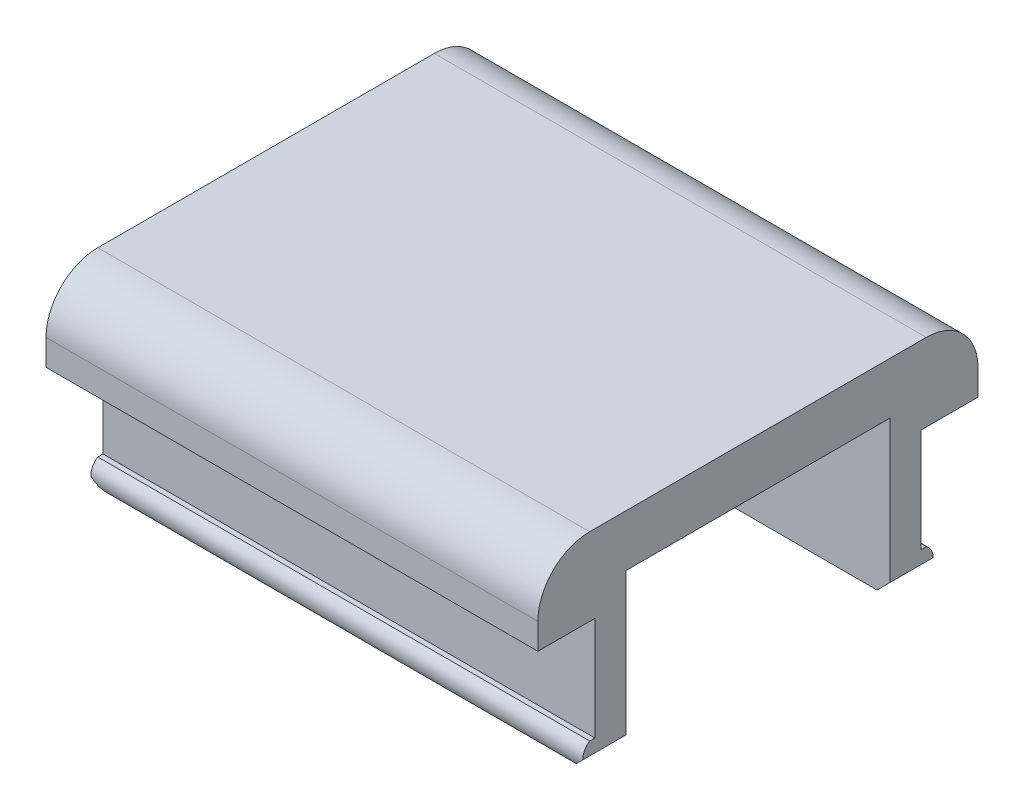
ISO-10303-21;
HEADER;
FILE_DESCRIPTION(('STEP AP214'),'2;1');
FILE_NAME('part.step','',(''),(''),'','','');
FILE_SCHEMA(('AUTOMOTIVE_DESIGN { 1 0 10303 214 1 1 1 1 }'));
ENDSEC;
DATA;
#1=APPLICATION_CONTEXT('core data for automotive mechanical design processes');
#2=APPLICATION_PROTOCOL_DEFINITION('international standard','automotive_design',2000,#1);
#3=PRODUCT_CONTEXT('',#1,'mechanical');
#4=PRODUCT('Part','Part','',(#3));
#5=PRODUCT_RELATED_PRODUCT_CATEGORY('part','',(#4));
#6=PRODUCT_DEFINITION_FORMATION('','',#4);
#7=PRODUCT_DEFINITION_CONTEXT('part definition',#1,'design');
#8=PRODUCT_DEFINITION('design','',#6,#7);
#9=PRODUCT_DEFINITION_SHAPE('','',#8);
#10=(LENGTH_UNIT() NAMED_UNIT(*) SI_UNIT(.MILLI.,.METRE.));
#11=(NAMED_UNIT(*) PLANE_ANGLE_UNIT() SI_UNIT($,.RADIAN.));
#12=(NAMED_UNIT(*) SI_UNIT($,.STERADIAN.) SOLID_ANGLE_UNIT());
#13=UNCERTAINTY_MEASURE_WITH_UNIT(LENGTH_MEASURE(1.E-05),#10,'distance_accuracy_value','');
#14=(GEOMETRIC_REPRESENTATION_CONTEXT(3) GLOBAL_UNCERTAINTY_ASSIGNED_CONTEXT((#13)) GLOBAL_UNIT_ASSIGNED_CONTEXT((#10,
#11,#12)) REPRESENTATION_CONTEXT('',''));
#15=CARTESIAN_POINT('',(0.,0.,0.));
#16=DIRECTION('',(0.,0.,1.));
#17=DIRECTION('',(1.,0.,0.));
#18=AXIS2_PLACEMENT_3D('',#15,#16,#17);
#19=CARTESIAN_POINT('',(0.,1.,-2.));
#20=DIRECTION('',(0.,1.,0.));
#21=DIRECTION('',(0.,0.,1.));
#22=AXIS2_PLACEMENT_3D('',#19,#20,#21);
#23=PLANE('',#22);
#24=DIRECTION('',(0.,0.,1.));
#25=VECTOR('',#24,1.);
#26=CARTESIAN_POINT('',(0.,1.,-2.));
#27=LINE('',#26,#25);
#28=CARTESIAN_POINT('',(0.,1.,-13.6));
#29=VERTEX_POINT('',#28);
#30=CARTESIAN_POINT('',(0.,1.,-3.4));
#31=VERTEX_POINT('',#30);
#32=EDGE_CURVE('E287',#29,#31,#27,.T.);
#33=ORIENTED_EDGE('',*,*,#32,.F.);
#34=DIRECTION('',(1.,0.,0.));
#35=VECTOR('',#34,1.);
#36=CARTESIAN_POINT('',(-6.05309838016863,1.,-13.6));
#37=LINE('',#36,#35);
#38=CARTESIAN_POINT('',(19.,1.,-13.6));
#39=VERTEX_POINT('',#38);
#40=EDGE_CURVE('E249',#29,#39,#37,.T.);
#41=ORIENTED_EDGE('',*,*,#40,.T.);
#42=DIRECTION('',(0.,0.,1.));
#43=VECTOR('',#42,1.);
#44=CARTESIAN_POINT('',(19.,1.,-2.));
#45=LINE('',#44,#43);
#46=CARTESIAN_POINT('',(19.,1.,-3.4));
#47=VERTEX_POINT('',#46);
#48=EDGE_CURVE('E286',#39,#47,#45,.T.);
#49=ORIENTED_EDGE('',*,*,#48,.T.);
#50=DIRECTION('',(1.,0.,0.));
#51=VECTOR('',#50,1.);
#52=CARTESIAN_POINT('',(-6.05309838016863,1.,-3.4));
#53=LINE('',#52,#51);
#54=EDGE_CURVE('E263',#31,#47,#53,.T.);
#55=ORIENTED_EDGE('',*,*,#54,.F.);
#56=EDGE_LOOP('',(#33,#41,#49,#55));
#57=FACE_BOUND('',#56,.T.);
#58=ADVANCED_FACE('F46',(#57),#23,.F.);
#59=CARTESIAN_POINT('',(19.,0.,0.));
#60=DIRECTION('',(0.,1.,0.));
#61=DIRECTION('',(0.,0.,1.));
#62=AXIS2_PLACEMENT_3D('',#59,#60,#61);
#63=PLANE('',#62);
#64=DIRECTION('',(0.,0.,-1.));
#65=VECTOR('',#64,1.);
#66=CARTESIAN_POINT('',(0.,0.,0.));
#67=LINE('',#66,#65);
#68=CARTESIAN_POINT('',(0.,0.,0.));
#69=VERTEX_POINT('',#68);
#70=CARTESIAN_POINT('',(0.,0.,-2.2));
#71=VERTEX_POINT('',#70);
#72=EDGE_CURVE('E207',#69,#71,#67,.T.);
#73=ORIENTED_EDGE('',*,*,#72,.T.);
#74=DIRECTION('',(1.,0.,0.));
#75=VECTOR('',#74,1.);
#76=CARTESIAN_POINT('',(-4.00499687890016,0.,-2.2));
#77=LINE('',#76,#75);
#78=CARTESIAN_POINT('',(19.,0.,-2.2));
#79=VERTEX_POINT('',#78);
#80=EDGE_CURVE('E242',#71,#79,#77,.T.);
#81=ORIENTED_EDGE('',*,*,#80,.T.);
#82=DIRECTION('',(0.,0.,-1.));
#83=VECTOR('',#82,1.);
#84=CARTESIAN_POINT('',(19.,0.,0.));
#85=LINE('',#84,#83);
#86=CARTESIAN_POINT('',(19.,0.,0.));
#87=VERTEX_POINT('',#86);
#88=EDGE_CURVE('E295',#87,#79,#85,.T.);
#89=ORIENTED_EDGE('',*,*,#88,.F.);
#90=DIRECTION('',(-1.,0.,0.));
#91=VECTOR('',#90,1.);
#92=CARTESIAN_POINT('',(19.,0.,0.));
#93=LINE('',#92,#91);
#94=EDGE_CURVE('E309',#87,#69,#93,.T.);
#95=ORIENTED_EDGE('',*,*,#94,.T.);
#96=EDGE_LOOP('',(#73,#81,#89,#95));
#97=FACE_BOUND('',#96,.T.);
#98=ADVANCED_FACE('F403',(#97),#63,.F.);
#99=CARTESIAN_POINT('',(19.,0.,0.));
#100=DIRECTION('',(0.,0.,-1.));
#101=DIRECTION('',(-1.,0.,0.));
#102=AXIS2_PLACEMENT_3D('',#99,#100,#101);
#103=PLANE('',#102);
#104=DIRECTION('',(0.,-1.,0.));
#105=VECTOR('',#104,1.);
#106=CARTESIAN_POINT('',(19.,0.,0.));
#107=LINE('',#106,#105);
#108=CARTESIAN_POINT('',(19.,1.,0.));
#109=VERTEX_POINT('',#108);
#110=EDGE_CURVE('E292',#109,#87,#107,.T.);
#111=ORIENTED_EDGE('',*,*,#110,.F.);
#112=DIRECTION('',(-1.,0.,0.));
#113=VECTOR('',#112,1.);
#114=CARTESIAN_POINT('',(19.,1.,0.));
#115=LINE('',#114,#113);
#116=CARTESIAN_POINT('',(0.,1.,0.));
#117=VERTEX_POINT('',#116);
#118=EDGE_CURVE('E327',#109,#117,#115,.T.);
#119=ORIENTED_EDGE('',*,*,#118,.T.);
#120=DIRECTION('',(0.,-1.,0.));
#121=VECTOR('',#120,1.);
#122=CARTESIAN_POINT('',(0.,0.,0.));
#123=LINE('',#122,#121);
#124=EDGE_CURVE('E208',#117,#69,#123,.T.);
#125=ORIENTED_EDGE('',*,*,#124,.T.);
#126=ORIENTED_EDGE('',*,*,#94,.F.);
#127=EDGE_LOOP('',(#111,#119,#125,#126));
#128=FACE_BOUND('',#127,.T.);
#129=ADVANCED_FACE('F407',(#128),#103,.F.);
#130=CARTESIAN_POINT('',(19.,0.,-14.8));
#131=VERTEX_POINT('',#130);
#132=CARTESIAN_POINT('',(19.,0.,-17.));
#133=VERTEX_POINT('',#132);
#134=EDGE_CURVE('E220',#131,#133,#85,.T.);
#135=ORIENTED_EDGE('',*,*,#134,.F.);
#136=DIRECTION('',(1.,0.,0.));
#137=VECTOR('',#136,1.);
#138=CARTESIAN_POINT('',(-4.00499687890016,0.,-14.8));
#139=LINE('',#138,#137);
#140=CARTESIAN_POINT('',(0.,0.,-14.8));
#141=VERTEX_POINT('',#140);
#142=EDGE_CURVE('E215',#141,#131,#139,.T.);
#143=ORIENTED_EDGE('',*,*,#142,.F.);
#144=CARTESIAN_POINT('',(0.,0.,-17.));
#145=VERTEX_POINT('',#144);
#146=EDGE_CURVE('E196',#141,#145,#67,.T.);
#147=ORIENTED_EDGE('',*,*,#146,.T.);
#148=DIRECTION('',(-1.,0.,0.));
#149=VECTOR('',#148,1.);
#150=CARTESIAN_POINT('',(19.,0.,-17.));
#151=LINE('',#150,#149);
#152=EDGE_CURVE('E303',#133,#145,#151,.T.);
#153=ORIENTED_EDGE('',*,*,#152,.F.);
#154=EDGE_LOOP('',(#135,#143,#147,#153));
#155=FACE_BOUND('',#154,.T.);
#156=ADVANCED_FACE('F219',(#155),#63,.F.);
#157=CARTESIAN_POINT('',(19.,0.,-17.));
#158=DIRECTION('',(0.,0.,1.));
#159=DIRECTION('',(1.,0.,0.));
#160=AXIS2_PLACEMENT_3D('',#157,#158,#159);
#161=PLANE('',#160);
#162=DIRECTION('',(0.,1.,0.));
#163=VECTOR('',#162,1.);
#164=CARTESIAN_POINT('',(0.,0.,-17.));
#165=LINE('',#164,#163);
#166=CARTESIAN_POINT('',(0.,1.,-17.));
#167=VERTEX_POINT('',#166);
#168=EDGE_CURVE('E202',#145,#167,#165,.T.);
#169=ORIENTED_EDGE('',*,*,#168,.T.);
#170=DIRECTION('',(-1.,0.,0.));
#171=VECTOR('',#170,1.);
#172=CARTESIAN_POINT('',(19.,1.,-17.));
#173=LINE('',#172,#171);
#174=CARTESIAN_POINT('',(19.,1.,-17.));
#175=VERTEX_POINT('',#174);
#176=EDGE_CURVE('E321',#167,#175,#173,.F.);
#177=ORIENTED_EDGE('',*,*,#176,.T.);
#178=DIRECTION('',(0.,1.,0.));
#179=VECTOR('',#178,1.);
#180=CARTESIAN_POINT('',(19.,0.,-17.));
#181=LINE('',#180,#179);
#182=EDGE_CURVE('E297',#133,#175,#181,.T.);
#183=ORIENTED_EDGE('',*,*,#182,.F.);
#184=ORIENTED_EDGE('',*,*,#152,.T.);
#185=EDGE_LOOP('',(#169,#177,#183,#184));
#186=FACE_BOUND('',#185,.T.);
#187=ADVANCED_FACE('F423',(#186),#161,.F.);
#188=CARTESIAN_POINT('',(19.,3.,0.));
#189=DIRECTION('',(0.,-1.,0.));
#190=DIRECTION('',(0.,0.,-1.));
#191=AXIS2_PLACEMENT_3D('',#188,#189,#190);
#192=PLANE('',#191);
#193=DIRECTION('',(0.,0.,1.));
#194=VECTOR('',#193,1.);
#195=CARTESIAN_POINT('',(19.,3.,0.));
#196=LINE('',#195,#194);
#197=CARTESIAN_POINT('',(19.,3.,-15.));
#198=VERTEX_POINT('',#197);
#199=CARTESIAN_POINT('',(19.,3.,-2.));
#200=VERTEX_POINT('',#199);
#201=EDGE_CURVE('E300',#198,#200,#196,.T.);
#202=ORIENTED_EDGE('',*,*,#201,.F.);
#203=DIRECTION('',(-1.,0.,0.));
#204=VECTOR('',#203,1.);
#205=CARTESIAN_POINT('',(19.,3.,-15.));
#206=LINE('',#205,#204);
#207=CARTESIAN_POINT('',(0.,3.,-15.));
#208=VERTEX_POINT('',#207);
#209=EDGE_CURVE('E314',#198,#208,#206,.T.);
#210=ORIENTED_EDGE('',*,*,#209,.T.);
#211=DIRECTION('',(0.,0.,1.));
#212=VECTOR('',#211,1.);
#213=CARTESIAN_POINT('',(0.,3.,0.));
#214=LINE('',#213,#212);
#215=CARTESIAN_POINT('',(0.,3.,-2.));
#216=VERTEX_POINT('',#215);
#217=EDGE_CURVE('E294',#208,#216,#214,.T.);
#218=ORIENTED_EDGE('',*,*,#217,.T.);
#219=DIRECTION('',(-1.,0.,0.));
#220=VECTOR('',#219,1.);
#221=CARTESIAN_POINT('',(19.,3.,-2.));
#222=LINE('',#221,#220);
#223=EDGE_CURVE('E312',#216,#200,#222,.F.);
#224=ORIENTED_EDGE('',*,*,#223,.T.);
#225=EDGE_LOOP('',(#202,#210,#218,#224));
#226=FACE_BOUND('',#225,.T.);
#227=ADVANCED_FACE('F414',(#226),#192,.F.);
#228=CARTESIAN_POINT('',(19.,0.,0.));
#229=DIRECTION('',(-1.,0.,0.));
#230=DIRECTION('',(0.,0.,1.));
#231=AXIS2_PLACEMENT_3D('',#228,#229,#230);
#232=PLANE('',#231);
#233=DIRECTION('',(0.,-1.,0.));
#234=VECTOR('',#233,1.);
#235=CARTESIAN_POINT('',(19.,1.,-13.6));
#236=LINE('',#235,#234);
#237=CARTESIAN_POINT('',(19.,-4.49999999999999,-13.6));
#238=VERTEX_POINT('',#237);
#239=EDGE_CURVE('E245',#39,#238,#236,.T.);
#240=ORIENTED_EDGE('',*,*,#239,.T.);
#241=DIRECTION('',(0.,0.,-1.));
#242=VECTOR('',#241,1.);
#243=CARTESIAN_POINT('',(19.,-4.49999999999999,-15.));
#244=LINE('',#243,#242);
#245=CARTESIAN_POINT('',(19.,-4.49999999999999,-15.2683375209645));
#246=VERTEX_POINT('',#245);
#247=EDGE_CURVE('E342',#238,#246,#244,.T.);
#248=ORIENTED_EDGE('',*,*,#247,.T.);
#249=CARTESIAN_POINT('',(19.,-4.5,-14.6683375209645));
#250=DIRECTION('',(1.,0.,0.));
#251=DIRECTION('',(0.,0.,-1.));
#252=AXIS2_PLACEMENT_3D('',#249,#250,#251);
#253=CIRCLE('',#252,0.599999999999999);
#254=CARTESIAN_POINT('',(19.,-4.,-15.));
#255=VERTEX_POINT('',#254);
#256=EDGE_CURVE('E266',#246,#255,#253,.T.);
#257=ORIENTED_EDGE('',*,*,#256,.T.);
#258=DIRECTION('',(0.,0.,-1.));
#259=VECTOR('',#258,1.);
#260=CARTESIAN_POINT('',(19.,-4.,-15.));
#261=LINE('',#260,#259);
#262=CARTESIAN_POINT('',(19.,-4.,-14.8));
#263=VERTEX_POINT('',#262);
#264=EDGE_CURVE('E221',#263,#255,#261,.T.);
#265=ORIENTED_EDGE('',*,*,#264,.F.);
#266=DIRECTION('',(0.,-1.,0.));
#267=VECTOR('',#266,1.);
#268=CARTESIAN_POINT('',(19.,0.,-14.8));
#269=LINE('',#268,#267);
#270=EDGE_CURVE('E224',#131,#263,#269,.T.);
#271=ORIENTED_EDGE('',*,*,#270,.F.);
#272=ORIENTED_EDGE('',*,*,#134,.T.);
#273=ORIENTED_EDGE('',*,*,#182,.T.);
#274=CARTESIAN_POINT('',(19.,1.,-15.));
#275=DIRECTION('',(-1.,0.,0.));
#276=DIRECTION('',(0.,0.,1.));
#277=AXIS2_PLACEMENT_3D('',#274,#275,#276);
#278=CIRCLE('',#277,2.);
#279=EDGE_CURVE('E325',#175,#198,#278,.F.);
#280=ORIENTED_EDGE('',*,*,#279,.T.);
#281=ORIENTED_EDGE('',*,*,#201,.T.);
#282=CARTESIAN_POINT('',(19.,1.,-2.));
#283=DIRECTION('',(-1.,0.,0.));
#284=DIRECTION('',(0.,0.,1.));
#285=AXIS2_PLACEMENT_3D('',#282,#283,#284);
#286=CIRCLE('',#285,2.);
#287=EDGE_CURVE('E323',#200,#109,#286,.F.);
#288=ORIENTED_EDGE('',*,*,#287,.T.);
#289=ORIENTED_EDGE('',*,*,#110,.T.);
#290=ORIENTED_EDGE('',*,*,#88,.T.);
#291=DIRECTION('',(0.,1.,0.));
#292=VECTOR('',#291,1.);
#293=CARTESIAN_POINT('',(19.,0.,-2.2));
#294=LINE('',#293,#292);
#295=CARTESIAN_POINT('',(19.,-4.,-2.2));
#296=VERTEX_POINT('',#295);
#297=EDGE_CURVE('E228',#296,#79,#294,.T.);
#298=ORIENTED_EDGE('',*,*,#297,.F.);
#299=DIRECTION('',(0.,0.,-1.));
#300=VECTOR('',#299,1.);
#301=CARTESIAN_POINT('',(19.,-4.,-2.));
#302=LINE('',#301,#300);
#303=CARTESIAN_POINT('',(19.,-4.,-2.));
#304=VERTEX_POINT('',#303);
#305=EDGE_CURVE('E232',#304,#296,#302,.T.);
#306=ORIENTED_EDGE('',*,*,#305,.F.);
#307=CARTESIAN_POINT('',(19.,-4.5,-2.33166247903554));
#308=DIRECTION('',(1.,0.,0.));
#309=DIRECTION('',(0.,0.,1.));
#310=AXIS2_PLACEMENT_3D('',#307,#308,#309);
#311=CIRCLE('',#310,0.6);
#312=CARTESIAN_POINT('',(19.,-4.5,-1.73166247903554));
#313=VERTEX_POINT('',#312);
#314=EDGE_CURVE('E274',#304,#313,#311,.T.);
#315=ORIENTED_EDGE('',*,*,#314,.T.);
#316=DIRECTION('',(0.,0.,-1.));
#317=VECTOR('',#316,1.);
#318=CARTESIAN_POINT('',(19.,-4.5,-3.4));
#319=LINE('',#318,#317);
#320=CARTESIAN_POINT('',(19.,-4.49999999999999,-3.4));
#321=VERTEX_POINT('',#320);
#322=EDGE_CURVE('E339',#313,#321,#319,.T.);
#323=ORIENTED_EDGE('',*,*,#322,.T.);
#324=DIRECTION('',(0.,1.,0.));
#325=VECTOR('',#324,1.);
#326=CARTESIAN_POINT('',(19.,1.,-3.4));
#327=LINE('',#326,#325);
#328=EDGE_CURVE('E256',#321,#47,#327,.T.);
#329=ORIENTED_EDGE('',*,*,#328,.T.);
#330=ORIENTED_EDGE('',*,*,#48,.F.);
#331=EDGE_LOOP('',(#240,#248,#257,#265,#271,#272,#273,#280,#281,#288,#289,#290,#298,#306,#315,
#323,#329,#330));
#332=FACE_BOUND('',#331,.T.);
#333=ADVANCED_FACE('F389',(#332),#232,.F.);
#334=CARTESIAN_POINT('',(0.,0.,0.));
#335=DIRECTION('',(-1.,0.,0.));
#336=DIRECTION('',(0.,0.,1.));
#337=AXIS2_PLACEMENT_3D('',#334,#335,#336);
#338=PLANE('',#337);
#339=DIRECTION('',(0.,1.,0.));
#340=VECTOR('',#339,1.);
#341=CARTESIAN_POINT('',(0.,1.,-3.4));
#342=LINE('',#341,#340);
#343=CARTESIAN_POINT('',(0.,-4.5,-3.4));
#344=VERTEX_POINT('',#343);
#345=EDGE_CURVE('E261',#344,#31,#342,.T.);
#346=ORIENTED_EDGE('',*,*,#345,.F.);
#347=DIRECTION('',(0.,0.,1.));
#348=VECTOR('',#347,1.);
#349=CARTESIAN_POINT('',(0.,-4.5,0.));
#350=LINE('',#349,#348);
#351=CARTESIAN_POINT('',(0.,-4.5,-1.73166247903554));
#352=VERTEX_POINT('',#351);
#353=EDGE_CURVE('E13',#344,#352,#350,.T.);
#354=ORIENTED_EDGE('',*,*,#353,.T.);
#355=CARTESIAN_POINT('',(0.,-4.5,-2.33166247903554));
#356=DIRECTION('',(-1.,0.,0.));
#357=DIRECTION('',(0.,0.,1.));
#358=AXIS2_PLACEMENT_3D('',#355,#356,#357);
#359=CIRCLE('',#358,0.6);
#360=CARTESIAN_POINT('',(0.,-4.,-2.));
#361=VERTEX_POINT('',#360);
#362=EDGE_CURVE('E278',#361,#352,#359,.F.);
#363=ORIENTED_EDGE('',*,*,#362,.F.);
#364=DIRECTION('',(0.,0.,-1.));
#365=VECTOR('',#364,1.);
#366=CARTESIAN_POINT('',(0.,-4.,-2.));
#367=LINE('',#366,#365);
#368=CARTESIAN_POINT('',(0.,-4.,-2.2));
#369=VERTEX_POINT('',#368);
#370=EDGE_CURVE('E231',#361,#369,#367,.T.);
#371=ORIENTED_EDGE('',*,*,#370,.T.);
#372=DIRECTION('',(0.,1.,0.));
#373=VECTOR('',#372,1.);
#374=CARTESIAN_POINT('',(0.,0.,-2.2));
#375=LINE('',#374,#373);
#376=EDGE_CURVE('E239',#369,#71,#375,.T.);
#377=ORIENTED_EDGE('',*,*,#376,.T.);
#378=ORIENTED_EDGE('',*,*,#72,.F.);
#379=ORIENTED_EDGE('',*,*,#124,.F.);
#380=CARTESIAN_POINT('',(0.,1.,-2.));
#381=DIRECTION('',(-1.,0.,0.));
#382=DIRECTION('',(0.,0.,1.));
#383=AXIS2_PLACEMENT_3D('',#380,#381,#382);
#384=CIRCLE('',#383,2.);
#385=EDGE_CURVE('E317',#117,#216,#384,.T.);
#386=ORIENTED_EDGE('',*,*,#385,.T.);
#387=ORIENTED_EDGE('',*,*,#217,.F.);
#388=CARTESIAN_POINT('',(0.,1.,-15.));
#389=DIRECTION('',(-1.,0.,0.));
#390=DIRECTION('',(0.,0.,1.));
#391=AXIS2_PLACEMENT_3D('',#388,#389,#390);
#392=CIRCLE('',#391,2.);
#393=EDGE_CURVE('E319',#208,#167,#392,.T.);
#394=ORIENTED_EDGE('',*,*,#393,.T.);
#395=ORIENTED_EDGE('',*,*,#168,.F.);
#396=ORIENTED_EDGE('',*,*,#146,.F.);
#397=DIRECTION('',(0.,-1.,0.));
#398=VECTOR('',#397,1.);
#399=CARTESIAN_POINT('',(0.,0.,-14.8));
#400=LINE('',#399,#398);
#401=CARTESIAN_POINT('',(0.,-4.,-14.8));
#402=VERTEX_POINT('',#401);
#403=EDGE_CURVE('E200',#141,#402,#400,.T.);
#404=ORIENTED_EDGE('',*,*,#403,.T.);
#405=DIRECTION('',(0.,0.,-1.));
#406=VECTOR('',#405,1.);
#407=CARTESIAN_POINT('',(0.,-4.,-15.));
#408=LINE('',#407,#406);
#409=CARTESIAN_POINT('',(0.,-4.,-15.));
#410=VERTEX_POINT('',#409);
#411=EDGE_CURVE('E235',#402,#410,#408,.T.);
#412=ORIENTED_EDGE('',*,*,#411,.T.);
#413=CARTESIAN_POINT('',(0.,-4.5,-14.6683375209645));
#414=DIRECTION('',(-1.,0.,0.));
#415=DIRECTION('',(0.,0.,1.));
#416=AXIS2_PLACEMENT_3D('',#413,#414,#415);
#417=CIRCLE('',#416,0.599999999999999);
#418=CARTESIAN_POINT('',(0.,-4.5,-15.2683375209645));
#419=VERTEX_POINT('',#418);
#420=EDGE_CURVE('E269',#419,#410,#417,.F.);
#421=ORIENTED_EDGE('',*,*,#420,.F.);
#422=DIRECTION('',(0.,0.,1.));
#423=VECTOR('',#422,1.);
#424=CARTESIAN_POINT('',(0.,-4.5,0.));
#425=LINE('',#424,#423);
#426=CARTESIAN_POINT('',(0.,-4.5,-13.6));
#427=VERTEX_POINT('',#426);
#428=EDGE_CURVE('E54',#419,#427,#425,.T.);
#429=ORIENTED_EDGE('',*,*,#428,.T.);
#430=DIRECTION('',(0.,-1.,0.));
#431=VECTOR('',#430,1.);
#432=CARTESIAN_POINT('',(0.,1.,-13.6));
#433=LINE('',#432,#431);
#434=EDGE_CURVE('E250',#29,#427,#433,.T.);
#435=ORIENTED_EDGE('',*,*,#434,.F.);
#436=ORIENTED_EDGE('',*,*,#32,.T.);
#437=EDGE_LOOP('',(#346,#354,#363,#371,#377,#378,#379,#386,#387,#394,#395,#396,#404,#412,#421,
#429,#435,#436));
#438=FACE_BOUND('',#437,.T.);
#439=ADVANCED_FACE('F198',(#438),#338,.T.);
#440=CARTESIAN_POINT('',(19.,1.,-15.));
#441=DIRECTION('',(-1.,0.,0.));
#442=DIRECTION('',(0.,0.,1.));
#443=AXIS2_PLACEMENT_3D('',#440,#441,#442);
#444=CYLINDRICAL_SURFACE('',#443,2.);
#445=ORIENTED_EDGE('',*,*,#279,.F.);
#446=ORIENTED_EDGE('',*,*,#176,.F.);
#447=ORIENTED_EDGE('',*,*,#393,.F.);
#448=ORIENTED_EDGE('',*,*,#209,.F.);
#449=EDGE_LOOP('',(#445,#446,#447,#448));
#450=FACE_BOUND('',#449,.T.);
#451=ADVANCED_FACE('F420',(#450),#444,.T.);
#452=CARTESIAN_POINT('',(19.,1.,-2.));
#453=DIRECTION('',(-1.,0.,0.));
#454=DIRECTION('',(0.,0.,1.));
#455=AXIS2_PLACEMENT_3D('',#452,#453,#454);
#456=CYLINDRICAL_SURFACE('',#455,2.);
#457=ORIENTED_EDGE('',*,*,#287,.F.);
#458=ORIENTED_EDGE('',*,*,#223,.F.);
#459=ORIENTED_EDGE('',*,*,#385,.F.);
#460=ORIENTED_EDGE('',*,*,#118,.F.);
#461=EDGE_LOOP('',(#457,#458,#459,#460));
#462=FACE_BOUND('',#461,.T.);
#463=ADVANCED_FACE('F417',(#462),#456,.T.);
#464=CARTESIAN_POINT('',(0.,-5.,0.));
#465=DIRECTION('',(0.,-1.,0.));
#466=DIRECTION('',(0.,0.,-1.));
#467=AXIS2_PLACEMENT_3D('',#464,#465,#466);
#468=PLANE('',#467);
#469=DIRECTION('',(1.,0.,0.));
#470=VECTOR('',#469,1.);
#471=CARTESIAN_POINT('',(-6.05309838016863,-5.,-3.4));
#472=LINE('',#471,#470);
#473=CARTESIAN_POINT('',(0.5,-5.,-3.4));
#474=VERTEX_POINT('',#473);
#475=CARTESIAN_POINT('',(18.5,-5.,-3.4));
#476=VERTEX_POINT('',#475);
#477=EDGE_CURVE('E260',#474,#476,#472,.T.);
#478=ORIENTED_EDGE('',*,*,#477,.T.);
#479=DIRECTION('',(0.,0.,1.));
#480=VECTOR('',#479,1.);
#481=CARTESIAN_POINT('',(18.5,-5.,-2.));
#482=LINE('',#481,#480);
#483=CARTESIAN_POINT('',(18.5,-5.,-2.));
#484=VERTEX_POINT('',#483);
#485=EDGE_CURVE('E67',#476,#484,#482,.T.);
#486=ORIENTED_EDGE('',*,*,#485,.T.);
#487=DIRECTION('',(1.,0.,0.));
#488=VECTOR('',#487,1.);
#489=CARTESIAN_POINT('',(0.,-5.,-2.));
#490=LINE('',#489,#488);
#491=CARTESIAN_POINT('',(0.5,-5.,-2.));
#492=VERTEX_POINT('',#491);
#493=EDGE_CURVE('E284',#492,#484,#490,.T.);
#494=ORIENTED_EDGE('',*,*,#493,.F.);
#495=DIRECTION('',(0.,0.,-1.));
#496=VECTOR('',#495,1.);
#497=CARTESIAN_POINT('',(0.5,-5.,0.));
#498=LINE('',#497,#496);
#499=EDGE_CURVE('E352',#492,#474,#498,.T.);
#500=ORIENTED_EDGE('',*,*,#499,.T.);
#501=EDGE_LOOP('',(#478,#486,#494,#500));
#502=FACE_BOUND('',#501,.T.);
#503=ADVANCED_FACE('F381',(#502),#468,.T.);
#504=CARTESIAN_POINT('',(0.,-5.,0.));
#505=DIRECTION('',(0.,-1.,0.));
#506=DIRECTION('',(0.,0.,-1.));
#507=AXIS2_PLACEMENT_3D('',#504,#505,#506);
#508=PLANE('',#507);
#509=DIRECTION('',(-1.,0.,0.));
#510=VECTOR('',#509,1.);
#511=CARTESIAN_POINT('',(19.,-5.,-15.));
#512=LINE('',#511,#510);
#513=CARTESIAN_POINT('',(18.5,-5.,-15.));
#514=VERTEX_POINT('',#513);
#515=CARTESIAN_POINT('',(0.500000000000004,-5.,-15.));
#516=VERTEX_POINT('',#515);
#517=EDGE_CURVE('E280',#514,#516,#512,.T.);
#518=ORIENTED_EDGE('',*,*,#517,.F.);
#519=DIRECTION('',(0.,0.,1.));
#520=VECTOR('',#519,1.);
#521=CARTESIAN_POINT('',(18.5,-5.,-13.6));
#522=LINE('',#521,#520);
#523=CARTESIAN_POINT('',(18.5,-5.,-13.6));
#524=VERTEX_POINT('',#523);
#525=EDGE_CURVE('E332',#514,#524,#522,.T.);
#526=ORIENTED_EDGE('',*,*,#525,.T.);
#527=DIRECTION('',(1.,0.,0.));
#528=VECTOR('',#527,1.);
#529=CARTESIAN_POINT('',(-6.05309838016863,-5.,-13.6));
#530=LINE('',#529,#528);
#531=CARTESIAN_POINT('',(0.500000000000004,-5.,-13.6));
#532=VERTEX_POINT('',#531);
#533=EDGE_CURVE('E253',#532,#524,#530,.T.);
#534=ORIENTED_EDGE('',*,*,#533,.F.);
#535=DIRECTION('',(0.,0.,-1.));
#536=VECTOR('',#535,1.);
#537=CARTESIAN_POINT('',(0.500000000000004,-5.,0.));
#538=LINE('',#537,#536);
#539=EDGE_CURVE('E330',#532,#516,#538,.T.);
#540=ORIENTED_EDGE('',*,*,#539,.T.);
#541=EDGE_LOOP('',(#518,#526,#534,#540));
#542=FACE_BOUND('',#541,.T.);
#543=ADVANCED_FACE('F438',(#542),#508,.T.);
#544=CARTESIAN_POINT('',(-1.03537675517531,-4.5,-2.33166247903554));
#545=DIRECTION('',(1.,0.,0.));
#546=DIRECTION('',(0.,0.,-1.));
#547=AXIS2_PLACEMENT_3D('',#544,#545,#546);
#548=CYLINDRICAL_SURFACE('',#547,0.6);
#549=ORIENTED_EDGE('',*,*,#493,.T.);
#550=CARTESIAN_POINT('',(19.,-4.5,-2.33166247903554));
#551=DIRECTION('',(0.707106781186545,-0.70710678118655,0.));
#552=DIRECTION('',(0.70710678118655,0.707106781186545,0.));
#553=AXIS2_PLACEMENT_3D('',#550,#551,#552);
#554=ELLIPSE('',#553,0.84852813742386,0.6);
#555=EDGE_CURVE('E358',#484,#313,#554,.F.);
#556=ORIENTED_EDGE('',*,*,#555,.T.);
#557=ORIENTED_EDGE('',*,*,#314,.F.);
#558=DIRECTION('',(1.,0.,0.));
#559=VECTOR('',#558,1.);
#560=CARTESIAN_POINT('',(-1.03537675517531,-4.,-2.));
#561=LINE('',#560,#559);
#562=EDGE_CURVE('E277',#361,#304,#561,.T.);
#563=ORIENTED_EDGE('',*,*,#562,.F.);
#564=ORIENTED_EDGE('',*,*,#362,.T.);
#565=CARTESIAN_POINT('',(0.,-4.5,-2.33166247903554));
#566=DIRECTION('',(0.70710678118655,0.707106781186545,0.));
#567=DIRECTION('',(0.707106781186545,-0.70710678118655,0.));
#568=AXIS2_PLACEMENT_3D('',#565,#566,#567);
#569=ELLIPSE('',#568,0.848528137423854,0.6);
#570=EDGE_CURVE('E356',#352,#492,#569,.T.);
#571=ORIENTED_EDGE('',*,*,#570,.T.);
#572=EDGE_LOOP('',(#549,#556,#557,#563,#564,#571));
#573=FACE_BOUND('',#572,.T.);
#574=ADVANCED_FACE('F378',(#573),#548,.T.);
#575=CARTESIAN_POINT('',(-1.03537675517531,-4.5,-14.6683375209645));
#576=DIRECTION('',(1.,0.,0.));
#577=DIRECTION('',(0.,0.,-1.));
#578=AXIS2_PLACEMENT_3D('',#575,#576,#577);
#579=CYLINDRICAL_SURFACE('',#578,0.599999999999999);
#580=ORIENTED_EDGE('',*,*,#256,.F.);
#581=CARTESIAN_POINT('',(19.,-4.5,-14.6683375209645));
#582=DIRECTION('',(0.707106781186552,-0.707106781186543,0.));
#583=DIRECTION('',(0.707106781186543,0.707106781186552,0.));
#584=AXIS2_PLACEMENT_3D('',#581,#582,#583);
#585=ELLIPSE('',#584,0.84852813742385,0.599999999999999);
#586=EDGE_CURVE('E346',#246,#514,#585,.F.);
#587=ORIENTED_EDGE('',*,*,#586,.T.);
#588=ORIENTED_EDGE('',*,*,#517,.T.);
#589=CARTESIAN_POINT('',(0.,-4.5,-14.6683375209645));
#590=DIRECTION('',(0.707106781186545,0.70710678118655,0.));
#591=DIRECTION('',(0.70710678118655,-0.707106781186545,0.));
#592=AXIS2_PLACEMENT_3D('',#589,#590,#591);
#593=ELLIPSE('',#592,0.848528137423859,0.599999999999999);
#594=EDGE_CURVE('E344',#516,#419,#593,.T.);
#595=ORIENTED_EDGE('',*,*,#594,.T.);
#596=ORIENTED_EDGE('',*,*,#420,.T.);
#597=DIRECTION('',(1.,0.,0.));
#598=VECTOR('',#597,1.);
#599=CARTESIAN_POINT('',(-1.03537675517531,-4.,-15.));
#600=LINE('',#599,#598);
#601=EDGE_CURVE('E271',#410,#255,#600,.T.);
#602=ORIENTED_EDGE('',*,*,#601,.T.);
#603=EDGE_LOOP('',(#580,#587,#588,#595,#596,#602));
#604=FACE_BOUND('',#603,.T.);
#605=ADVANCED_FACE('F433',(#604),#579,.T.);
#606=CARTESIAN_POINT('',(-6.05309838016863,1.,-3.4));
#607=DIRECTION('',(0.,0.,-1.));
#608=DIRECTION('',(0.,1.,0.));
#609=AXIS2_PLACEMENT_3D('',#606,#607,#608);
#610=PLANE('',#609);
#611=ORIENTED_EDGE('',*,*,#328,.F.);
#612=DIRECTION('',(-0.70710678118655,-0.707106781186545,0.));
#613=VECTOR('',#612,1.);
#614=CARTESIAN_POINT('',(9.2234508099156,-14.2765491900843,-3.4));
#615=LINE('',#614,#613);
#616=EDGE_CURVE('E350',#321,#476,#615,.T.);
#617=ORIENTED_EDGE('',*,*,#616,.T.);
#618=ORIENTED_EDGE('',*,*,#477,.F.);
#619=DIRECTION('',(0.707106781186545,-0.70710678118655,0.));
#620=VECTOR('',#619,1.);
#621=CARTESIAN_POINT('',(-5.77654919008429,1.27654919008433,-3.4));
#622=LINE('',#621,#620);
#623=EDGE_CURVE('E348',#474,#344,#622,.F.);
#624=ORIENTED_EDGE('',*,*,#623,.T.);
#625=ORIENTED_EDGE('',*,*,#345,.T.);
#626=ORIENTED_EDGE('',*,*,#54,.T.);
#627=EDGE_LOOP('',(#611,#617,#618,#624,#625,#626));
#628=FACE_BOUND('',#627,.T.);
#629=ADVANCED_FACE('F384',(#628),#610,.T.);
#630=CARTESIAN_POINT('',(-6.05309838016863,1.,-13.6));
#631=DIRECTION('',(0.,0.,1.));
#632=DIRECTION('',(1.,0.,0.));
#633=AXIS2_PLACEMENT_3D('',#630,#631,#632);
#634=PLANE('',#633);
#635=ORIENTED_EDGE('',*,*,#533,.T.);
#636=DIRECTION('',(0.707106781186543,0.707106781186552,0.));
#637=VECTOR('',#636,1.);
#638=CARTESIAN_POINT('',(9.22345080991586,-14.2765491900843,-13.6));
#639=LINE('',#638,#637);
#640=EDGE_CURVE('E337',#524,#238,#639,.T.);
#641=ORIENTED_EDGE('',*,*,#640,.T.);
#642=ORIENTED_EDGE('',*,*,#239,.F.);
#643=ORIENTED_EDGE('',*,*,#40,.F.);
#644=ORIENTED_EDGE('',*,*,#434,.T.);
#645=DIRECTION('',(-0.70710678118655,0.707106781186545,0.));
#646=VECTOR('',#645,1.);
#647=CARTESIAN_POINT('',(-5.77654919008433,1.27654919008429,-13.6));
#648=LINE('',#647,#646);
#649=EDGE_CURVE('E335',#427,#532,#648,.F.);
#650=ORIENTED_EDGE('',*,*,#649,.T.);
#651=EDGE_LOOP('',(#635,#641,#642,#643,#644,#650));
#652=FACE_BOUND('',#651,.T.);
#653=ADVANCED_FACE('F366',(#652),#634,.T.);
#654=CARTESIAN_POINT('',(-4.00499687890016,-4.,-2.));
#655=DIRECTION('',(0.,-1.,0.));
#656=DIRECTION('',(0.,0.,-1.));
#657=AXIS2_PLACEMENT_3D('',#654,#655,#656);
#658=PLANE('',#657);
#659=ORIENTED_EDGE('',*,*,#562,.T.);
#660=ORIENTED_EDGE('',*,*,#305,.T.);
#661=DIRECTION('',(1.,0.,0.));
#662=VECTOR('',#661,1.);
#663=CARTESIAN_POINT('',(-4.00499687890016,-4.,-2.2));
#664=LINE('',#663,#662);
#665=EDGE_CURVE('E238',#369,#296,#664,.T.);
#666=ORIENTED_EDGE('',*,*,#665,.F.);
#667=ORIENTED_EDGE('',*,*,#370,.F.);
#668=EDGE_LOOP('',(#659,#660,#666,#667));
#669=FACE_BOUND('',#668,.T.);
#670=ADVANCED_FACE('F394',(#669),#658,.F.);
#671=CARTESIAN_POINT('',(-4.00499687890016,0.,-2.2));
#672=DIRECTION('',(0.,0.,-1.));
#673=DIRECTION('',(0.,1.,0.));
#674=AXIS2_PLACEMENT_3D('',#671,#672,#673);
#675=PLANE('',#674);
#676=ORIENTED_EDGE('',*,*,#665,.T.);
#677=ORIENTED_EDGE('',*,*,#297,.T.);
#678=ORIENTED_EDGE('',*,*,#80,.F.);
#679=ORIENTED_EDGE('',*,*,#376,.F.);
#680=EDGE_LOOP('',(#676,#677,#678,#679));
#681=FACE_BOUND('',#680,.T.);
#682=ADVANCED_FACE('F400',(#681),#675,.F.);
#683=CARTESIAN_POINT('',(-4.00499687890016,0.,-14.8));
#684=DIRECTION('',(0.,0.,1.));
#685=DIRECTION('',(1.,0.,0.));
#686=AXIS2_PLACEMENT_3D('',#683,#684,#685);
#687=PLANE('',#686);
#688=ORIENTED_EDGE('',*,*,#142,.T.);
#689=ORIENTED_EDGE('',*,*,#270,.T.);
#690=DIRECTION('',(1.,0.,0.));
#691=VECTOR('',#690,1.);
#692=CARTESIAN_POINT('',(-4.00499687890016,-4.,-14.8));
#693=LINE('',#692,#691);
#694=EDGE_CURVE('E217',#402,#263,#693,.T.);
#695=ORIENTED_EDGE('',*,*,#694,.F.);
#696=ORIENTED_EDGE('',*,*,#403,.F.);
#697=EDGE_LOOP('',(#688,#689,#695,#696));
#698=FACE_BOUND('',#697,.T.);
#699=ADVANCED_FACE('F213',(#698),#687,.F.);
#700=CARTESIAN_POINT('',(-4.00499687890016,-4.,-15.));
#701=DIRECTION('',(0.,-1.,0.));
#702=DIRECTION('',(0.,0.,-1.));
#703=AXIS2_PLACEMENT_3D('',#700,#701,#702);
#704=PLANE('',#703);
#705=ORIENTED_EDGE('',*,*,#694,.T.);
#706=ORIENTED_EDGE('',*,*,#264,.T.);
#707=ORIENTED_EDGE('',*,*,#601,.F.);
#708=ORIENTED_EDGE('',*,*,#411,.F.);
#709=EDGE_LOOP('',(#705,#706,#707,#708));
#710=FACE_BOUND('',#709,.T.);
#711=ADVANCED_FACE('F429',(#710),#704,.F.);
#712=CARTESIAN_POINT('',(18.5,-5.,0.));
#713=DIRECTION('',(0.707106781186552,-0.707106781186543,0.));
#714=DIRECTION('',(0.,0.,-1.));
#715=AXIS2_PLACEMENT_3D('',#712,#713,#714);
#716=PLANE('',#715);
#717=ORIENTED_EDGE('',*,*,#586,.F.);
#718=ORIENTED_EDGE('',*,*,#247,.F.);
#719=ORIENTED_EDGE('',*,*,#640,.F.);
#720=ORIENTED_EDGE('',*,*,#525,.F.);
#721=EDGE_LOOP('',(#717,#718,#719,#720));
#722=FACE_BOUND('',#721,.T.);
#723=ADVANCED_FACE('F442',(#722),#716,.T.);
#724=CARTESIAN_POINT('',(19.,-4.5,0.));
#725=DIRECTION('',(0.707106781186545,-0.70710678118655,0.));
#726=DIRECTION('',(0.,0.,1.));
#727=AXIS2_PLACEMENT_3D('',#724,#725,#726);
#728=PLANE('',#727);
#729=ORIENTED_EDGE('',*,*,#555,.F.);
#730=ORIENTED_EDGE('',*,*,#485,.F.);
#731=ORIENTED_EDGE('',*,*,#616,.F.);
#732=ORIENTED_EDGE('',*,*,#322,.F.);
#733=EDGE_LOOP('',(#729,#730,#731,#732));
#734=FACE_BOUND('',#733,.T.);
#735=ADVANCED_FACE('F387',(#734),#728,.T.);
#736=CARTESIAN_POINT('',(0.5,-5.,0.));
#737=DIRECTION('',(0.70710678118655,0.707106781186545,0.));
#738=DIRECTION('',(0.,0.,-1.));
#739=AXIS2_PLACEMENT_3D('',#736,#737,#738);
#740=PLANE('',#739);
#741=ORIENTED_EDGE('',*,*,#570,.F.);
#742=ORIENTED_EDGE('',*,*,#353,.F.);
#743=ORIENTED_EDGE('',*,*,#623,.F.);
#744=ORIENTED_EDGE('',*,*,#499,.F.);
#745=EDGE_LOOP('',(#741,#742,#743,#744));
#746=FACE_BOUND('',#745,.T.);
#747=ADVANCED_FACE('F375',(#746),#740,.F.);
#748=CARTESIAN_POINT('',(0.,-4.5,0.));
#749=DIRECTION('',(0.707106781186545,0.70710678118655,0.));
#750=DIRECTION('',(0.,0.,1.));
#751=AXIS2_PLACEMENT_3D('',#748,#749,#750);
#752=PLANE('',#751);
#753=ORIENTED_EDGE('',*,*,#594,.F.);
#754=ORIENTED_EDGE('',*,*,#539,.F.);
#755=ORIENTED_EDGE('',*,*,#649,.F.);
#756=ORIENTED_EDGE('',*,*,#428,.F.);
#757=EDGE_LOOP('',(#753,#754,#755,#756));
#758=FACE_BOUND('',#757,.T.);
#759=ADVANCED_FACE('F48',(#758),#752,.F.);
#760=CLOSED_SHELL('',(#58,#98,#129,#156,#187,#227,#333,#439,#451,#463,#503,#543,#574,#605,#629,
#653,#670,#682,#699,#711,#723,#735,#747,#759));
#761=MANIFOLD_SOLID_BREP('B2',#760);
#762=ADVANCED_BREP_SHAPE_REPRESENTATION('',(#18,#761),#14);
#763=SHAPE_DEFINITION_REPRESENTATION(#9,#762);
ENDSEC;
END-ISO-10303-21;
